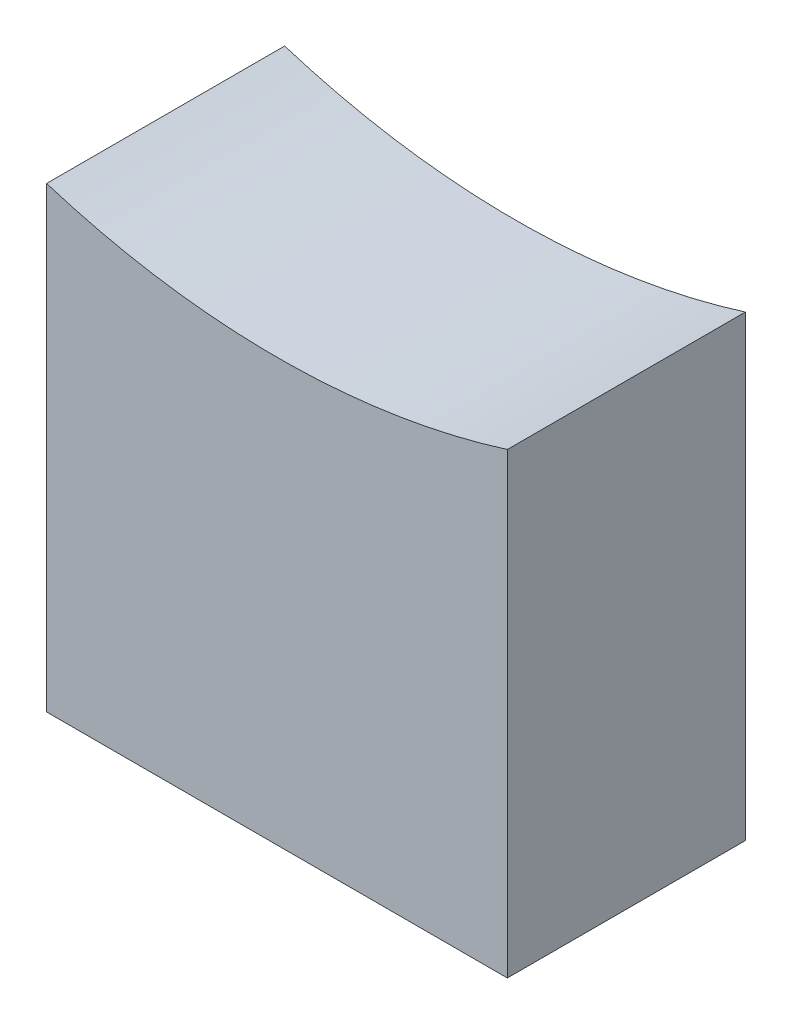
ISO-10303-21;
HEADER;
FILE_DESCRIPTION(('STEP AP214'),'2;1');
FILE_NAME('part.step','',(''),(''),'','','');
FILE_SCHEMA(('AUTOMOTIVE_DESIGN { 1 0 10303 214 1 1 1 1 }'));
ENDSEC;
DATA;
#1=APPLICATION_CONTEXT('core data for automotive mechanical design processes');
#2=APPLICATION_PROTOCOL_DEFINITION('international standard','automotive_design',2000,#1);
#3=PRODUCT_CONTEXT('',#1,'mechanical');
#4=PRODUCT('Part','Part','',(#3));
#5=PRODUCT_RELATED_PRODUCT_CATEGORY('part','',(#4));
#6=PRODUCT_DEFINITION_FORMATION('','',#4);
#7=PRODUCT_DEFINITION_CONTEXT('part definition',#1,'design');
#8=PRODUCT_DEFINITION('design','',#6,#7);
#9=PRODUCT_DEFINITION_SHAPE('','',#8);
#10=(LENGTH_UNIT() NAMED_UNIT(*) SI_UNIT(.MILLI.,.METRE.));
#11=(NAMED_UNIT(*) PLANE_ANGLE_UNIT() SI_UNIT($,.RADIAN.));
#12=(NAMED_UNIT(*) SI_UNIT($,.STERADIAN.) SOLID_ANGLE_UNIT());
#13=UNCERTAINTY_MEASURE_WITH_UNIT(LENGTH_MEASURE(1.E-05),#10,'distance_accuracy_value','');
#14=(GEOMETRIC_REPRESENTATION_CONTEXT(3) GLOBAL_UNCERTAINTY_ASSIGNED_CONTEXT((#13)) GLOBAL_UNIT_ASSIGNED_CONTEXT((#10,
#11,#12)) REPRESENTATION_CONTEXT('',''));
#15=CARTESIAN_POINT('',(0.,0.,0.));
#16=DIRECTION('',(0.,0.,1.));
#17=DIRECTION('',(1.,0.,0.));
#18=AXIS2_PLACEMENT_3D('',#15,#16,#17);
#19=CARTESIAN_POINT('',(2.567811299009E-05,0.0002481298803748,-0.05));
#20=DIRECTION('',(0.,0.,-1.));
#21=DIRECTION('',(-1.,0.,0.));
#22=AXIS2_PLACEMENT_3D('',#19,#20,#21);
#23=PLANE('',#22);
#24=DIRECTION('',(1.,0.,0.));
#25=VECTOR('',#24,1.);
#26=CARTESIAN_POINT('',(0.3,-1.55,-0.05));
#27=LINE('',#26,#25);
#28=CARTESIAN_POINT('',(-0.3,-1.55,-0.05));
#29=VERTEX_POINT('',#28);
#30=CARTESIAN_POINT('',(0.3,-1.55,-0.05));
#31=VERTEX_POINT('',#30);
#32=EDGE_CURVE('E58',#29,#31,#27,.T.);
#33=ORIENTED_EDGE('',*,*,#32,.T.);
#34=DIRECTION('',(0.,-1.,0.));
#35=VECTOR('',#34,1.);
#36=CARTESIAN_POINT('',(0.3,-0.953955347866,-0.05));
#37=LINE('',#36,#35);
#38=CARTESIAN_POINT('',(0.3,-0.953955347866472,-0.05));
#39=VERTEX_POINT('',#38);
#40=EDGE_CURVE('E73',#31,#39,#37,.F.);
#41=ORIENTED_EDGE('',*,*,#40,.T.);
#42=CARTESIAN_POINT('',(2.567811299009E-05,0.0002481298803748,-0.05));
#43=DIRECTION('',(0.,0.,1.));
#44=DIRECTION('',(1.,0.,0.));
#45=AXIS2_PLACEMENT_3D('',#42,#43,#44);
#46=CIRCLE('',#45,1.000244405501);
#47=CARTESIAN_POINT('',(-0.300000000000018,-0.953939201417248,-0.05));
#48=VERTEX_POINT('',#47);
#49=EDGE_CURVE('E19',#39,#48,#46,.F.);
#50=ORIENTED_EDGE('',*,*,#49,.T.);
#51=DIRECTION('',(0.,1.,0.));
#52=VECTOR('',#51,1.);
#53=CARTESIAN_POINT('',(-0.3,-1.55,-0.05));
#54=LINE('',#53,#52);
#55=EDGE_CURVE('E53',#48,#29,#54,.F.);
#56=ORIENTED_EDGE('',*,*,#55,.T.);
#57=EDGE_LOOP('',(#33,#41,#50,#56));
#58=FACE_BOUND('',#57,.T.);
#59=ADVANCED_FACE('F16',(#58),#23,.F.);
#60=CARTESIAN_POINT('',(0.3,-1.55,-0.36));
#61=DIRECTION('',(0.,1.,0.));
#62=DIRECTION('',(0.,0.,1.));
#63=AXIS2_PLACEMENT_3D('',#60,#61,#62);
#64=PLANE('',#63);
#65=DIRECTION('',(0.,0.,1.));
#66=VECTOR('',#65,1.);
#67=CARTESIAN_POINT('',(-0.3,-1.55,-0.36));
#68=LINE('',#67,#66);
#69=CARTESIAN_POINT('',(-0.3,-1.55,-0.36));
#70=VERTEX_POINT('',#69);
#71=EDGE_CURVE('E68',#29,#70,#68,.F.);
#72=ORIENTED_EDGE('',*,*,#71,.T.);
#73=DIRECTION('',(-1.,0.,0.));
#74=VECTOR('',#73,1.);
#75=CARTESIAN_POINT('',(2.567811299009E-05,-1.55,-0.36));
#76=LINE('',#75,#74);
#77=CARTESIAN_POINT('',(0.3,-1.55,-0.36));
#78=VERTEX_POINT('',#77);
#79=EDGE_CURVE('E63',#78,#70,#76,.T.);
#80=ORIENTED_EDGE('',*,*,#79,.F.);
#81=DIRECTION('',(0.,0.,1.));
#82=VECTOR('',#81,1.);
#83=CARTESIAN_POINT('',(0.3,-1.55,-0.36));
#84=LINE('',#83,#82);
#85=EDGE_CURVE('E66',#78,#31,#84,.T.);
#86=ORIENTED_EDGE('',*,*,#85,.T.);
#87=ORIENTED_EDGE('',*,*,#32,.F.);
#88=EDGE_LOOP('',(#72,#80,#86,#87));
#89=FACE_BOUND('',#88,.T.);
#90=ADVANCED_FACE('F65',(#89),#64,.F.);
#91=CARTESIAN_POINT('',(-0.3,-1.55,-0.36));
#92=DIRECTION('',(1.,0.,0.));
#93=DIRECTION('',(0.,1.,0.));
#94=AXIS2_PLACEMENT_3D('',#91,#92,#93);
#95=PLANE('',#94);
#96=DIRECTION('',(0.,0.,1.));
#97=VECTOR('',#96,1.);
#98=CARTESIAN_POINT('',(-0.300000000000036,-0.953939201417242,-0.36));
#99=LINE('',#98,#97);
#100=CARTESIAN_POINT('',(-0.300000000000018,-0.953939201417248,-0.36));
#101=VERTEX_POINT('',#100);
#102=EDGE_CURVE('E85',#48,#101,#99,.F.);
#103=ORIENTED_EDGE('',*,*,#102,.T.);
#104=DIRECTION('',(0.,1.,0.));
#105=VECTOR('',#104,1.);
#106=CARTESIAN_POINT('',(-0.3,0.0002481298803748,-0.36));
#107=LINE('',#106,#105);
#108=EDGE_CURVE('E72',#70,#101,#107,.T.);
#109=ORIENTED_EDGE('',*,*,#108,.F.);
#110=ORIENTED_EDGE('',*,*,#71,.F.);
#111=ORIENTED_EDGE('',*,*,#55,.F.);
#112=EDGE_LOOP('',(#103,#109,#110,#111));
#113=FACE_BOUND('',#112,.T.);
#114=ADVANCED_FACE('F106',(#113),#95,.F.);
#115=CARTESIAN_POINT('',(2.567811299009E-05,0.0002481298803748,-0.36));
#116=DIRECTION('',(0.,0.,1.));
#117=DIRECTION('',(1.,0.,0.));
#118=AXIS2_PLACEMENT_3D('',#115,#116,#117);
#119=CYLINDRICAL_SURFACE('',#118,1.000244405501);
#120=DIRECTION('',(0.,0.,1.));
#121=VECTOR('',#120,1.);
#122=CARTESIAN_POINT('',(0.3,-0.953955347866315,-0.36));
#123=LINE('',#122,#121);
#124=CARTESIAN_POINT('',(0.3,-0.953955347866472,-0.36));
#125=VERTEX_POINT('',#124);
#126=EDGE_CURVE('E34',#39,#125,#123,.F.);
#127=ORIENTED_EDGE('',*,*,#126,.T.);
#128=CARTESIAN_POINT('',(2.567811299009E-05,0.0002481298803748,-0.36));
#129=DIRECTION('',(0.,0.,1.));
#130=DIRECTION('',(1.,0.,0.));
#131=AXIS2_PLACEMENT_3D('',#128,#129,#130);
#132=CIRCLE('',#131,1.000244405501);
#133=EDGE_CURVE('E25',#101,#125,#132,.T.);
#134=ORIENTED_EDGE('',*,*,#133,.F.);
#135=ORIENTED_EDGE('',*,*,#102,.F.);
#136=ORIENTED_EDGE('',*,*,#49,.F.);
#137=EDGE_LOOP('',(#127,#134,#135,#136));
#138=FACE_BOUND('',#137,.T.);
#139=ADVANCED_FACE('F105',(#138),#119,.F.);
#140=CARTESIAN_POINT('',(0.3,-0.953955347866,-0.36));
#141=DIRECTION('',(-1.,0.,0.));
#142=DIRECTION('',(0.,-1.,0.));
#143=AXIS2_PLACEMENT_3D('',#140,#141,#142);
#144=PLANE('',#143);
#145=ORIENTED_EDGE('',*,*,#85,.F.);
#146=DIRECTION('',(0.,1.,0.));
#147=VECTOR('',#146,1.);
#148=CARTESIAN_POINT('',(0.3,0.0002481298803748,-0.36));
#149=LINE('',#148,#147);
#150=EDGE_CURVE('E11',#125,#78,#149,.F.);
#151=ORIENTED_EDGE('',*,*,#150,.F.);
#152=ORIENTED_EDGE('',*,*,#126,.F.);
#153=ORIENTED_EDGE('',*,*,#40,.F.);
#154=EDGE_LOOP('',(#145,#151,#152,#153));
#155=FACE_BOUND('',#154,.T.);
#156=ADVANCED_FACE('F76',(#155),#144,.F.);
#157=CARTESIAN_POINT('',(2.567811299009E-05,0.0002481298803748,-0.36));
#158=DIRECTION('',(0.,0.,-1.));
#159=DIRECTION('',(-1.,0.,0.));
#160=AXIS2_PLACEMENT_3D('',#157,#158,#159);
#161=PLANE('',#160);
#162=ORIENTED_EDGE('',*,*,#133,.T.);
#163=ORIENTED_EDGE('',*,*,#150,.T.);
#164=ORIENTED_EDGE('',*,*,#79,.T.);
#165=ORIENTED_EDGE('',*,*,#108,.T.);
#166=EDGE_LOOP('',(#162,#163,#164,#165));
#167=FACE_BOUND('',#166,.T.);
#168=ADVANCED_FACE('F79',(#167),#161,.T.);
#169=CLOSED_SHELL('',(#59,#90,#114,#139,#156,#168));
#170=MANIFOLD_SOLID_BREP('B1',#169);
#171=ADVANCED_BREP_SHAPE_REPRESENTATION('',(#18,#170),#14);
#172=SHAPE_DEFINITION_REPRESENTATION(#9,#171);
ENDSEC;
END-ISO-10303-21;
